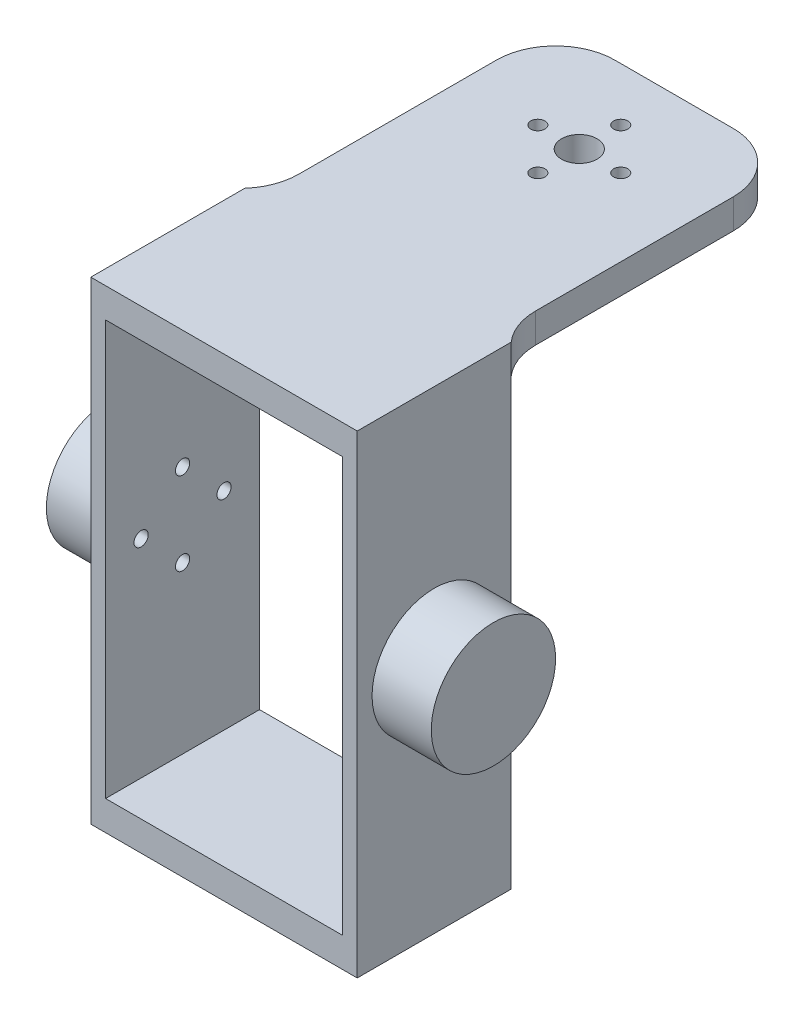
ISO-10303-21;
HEADER;
FILE_DESCRIPTION(('STEP AP214'),'2;1');
FILE_NAME('part.step','',(''),(''),'','','');
FILE_SCHEMA(('AUTOMOTIVE_DESIGN { 1 0 10303 214 1 1 1 1 }'));
ENDSEC;
DATA;
#1=APPLICATION_CONTEXT('core data for automotive mechanical design processes');
#2=APPLICATION_PROTOCOL_DEFINITION('international standard','automotive_design',2000,#1);
#3=PRODUCT_CONTEXT('',#1,'mechanical');
#4=PRODUCT('Part','Part','',(#3));
#5=PRODUCT_RELATED_PRODUCT_CATEGORY('part','',(#4));
#6=PRODUCT_DEFINITION_FORMATION('','',#4);
#7=PRODUCT_DEFINITION_CONTEXT('part definition',#1,'design');
#8=PRODUCT_DEFINITION('design','',#6,#7);
#9=PRODUCT_DEFINITION_SHAPE('','',#8);
#10=(LENGTH_UNIT() NAMED_UNIT(*) SI_UNIT(.MILLI.,.METRE.));
#11=(NAMED_UNIT(*) PLANE_ANGLE_UNIT() SI_UNIT($,.RADIAN.));
#12=(NAMED_UNIT(*) SI_UNIT($,.STERADIAN.) SOLID_ANGLE_UNIT());
#13=UNCERTAINTY_MEASURE_WITH_UNIT(LENGTH_MEASURE(1.E-05),#10,'distance_accuracy_value','');
#14=(GEOMETRIC_REPRESENTATION_CONTEXT(3) GLOBAL_UNCERTAINTY_ASSIGNED_CONTEXT((#13)) GLOBAL_UNIT_ASSIGNED_CONTEXT((#10,
#11,#12)) REPRESENTATION_CONTEXT('',''));
#15=CARTESIAN_POINT('',(0.,0.,0.));
#16=DIRECTION('',(0.,0.,1.));
#17=DIRECTION('',(1.,0.,0.));
#18=AXIS2_PLACEMENT_3D('',#15,#16,#17);
#19=CARTESIAN_POINT('',(0.,5.,-26.));
#20=DIRECTION('',(0.,0.,1.));
#21=DIRECTION('',(1.,0.,0.));
#22=AXIS2_PLACEMENT_3D('',#19,#20,#21);
#23=PLANE('',#22);
#24=DIRECTION('',(0.,-1.,0.));
#25=VECTOR('',#24,1.);
#26=CARTESIAN_POINT('',(0.,5.,-26.));
#27=LINE('',#26,#25);
#28=CARTESIAN_POINT('',(0.,75.,-26.));
#29=VERTEX_POINT('',#28);
#30=CARTESIAN_POINT('',(0.,0.,-26.));
#31=VERTEX_POINT('',#30);
#32=EDGE_CURVE('E206',#29,#31,#27,.T.);
#33=ORIENTED_EDGE('',*,*,#32,.F.);
#34=DIRECTION('',(1.,0.,0.));
#35=VECTOR('',#34,1.);
#36=CARTESIAN_POINT('',(0.,75.,-26.));
#37=LINE('',#36,#35);
#38=CARTESIAN_POINT('',(2.5,75.,-26.));
#39=VERTEX_POINT('',#38);
#40=EDGE_CURVE('E59',#29,#39,#37,.T.);
#41=ORIENTED_EDGE('',*,*,#40,.T.);
#42=DIRECTION('',(0.,-1.,0.));
#43=VECTOR('',#42,1.);
#44=CARTESIAN_POINT('',(2.5,75.,-26.));
#45=LINE('',#44,#43);
#46=CARTESIAN_POINT('',(2.5,5.,-26.));
#47=VERTEX_POINT('',#46);
#48=EDGE_CURVE('E193',#39,#47,#45,.T.);
#49=ORIENTED_EDGE('',*,*,#48,.T.);
#50=DIRECTION('',(-1.,0.,0.));
#51=VECTOR('',#50,1.);
#52=CARTESIAN_POINT('',(0.,5.,-26.));
#53=LINE('',#52,#51);
#54=CARTESIAN_POINT('',(42.5,5.,-26.));
#55=VERTEX_POINT('',#54);
#56=EDGE_CURVE('E203',#55,#47,#53,.T.);
#57=ORIENTED_EDGE('',*,*,#56,.F.);
#58=DIRECTION('',(0.,-1.,0.));
#59=VECTOR('',#58,1.);
#60=CARTESIAN_POINT('',(42.5,75.,-26.));
#61=LINE('',#60,#59);
#62=CARTESIAN_POINT('',(42.5,75.,-26.));
#63=VERTEX_POINT('',#62);
#64=EDGE_CURVE('E182',#63,#55,#61,.T.);
#65=ORIENTED_EDGE('',*,*,#64,.F.);
#66=DIRECTION('',(1.,0.,0.));
#67=VECTOR('',#66,1.);
#68=CARTESIAN_POINT('',(0.,75.,-26.));
#69=LINE('',#68,#67);
#70=CARTESIAN_POINT('',(45.,75.,-26.));
#71=VERTEX_POINT('',#70);
#72=EDGE_CURVE('E52',#63,#71,#69,.T.);
#73=ORIENTED_EDGE('',*,*,#72,.T.);
#74=DIRECTION('',(0.,-1.,0.));
#75=VECTOR('',#74,1.);
#76=CARTESIAN_POINT('',(45.,5.,-26.));
#77=LINE('',#76,#75);
#78=CARTESIAN_POINT('',(45.,0.,-26.));
#79=VERTEX_POINT('',#78);
#80=EDGE_CURVE('E217',#71,#79,#77,.T.);
#81=ORIENTED_EDGE('',*,*,#80,.T.);
#82=DIRECTION('',(-1.,0.,0.));
#83=VECTOR('',#82,1.);
#84=CARTESIAN_POINT('',(0.,0.,-26.));
#85=LINE('',#84,#83);
#86=EDGE_CURVE('E204',#79,#31,#85,.T.);
#87=ORIENTED_EDGE('',*,*,#86,.T.);
#88=EDGE_LOOP('',(#33,#41,#49,#57,#65,#73,#81,#87));
#89=FACE_BOUND('',#88,.T.);
#90=ADVANCED_FACE('F37',(#89),#23,.F.);
#91=CARTESIAN_POINT('',(0.,5.,0.));
#92=DIRECTION('',(0.,-1.,0.));
#93=DIRECTION('',(0.,0.,-1.));
#94=AXIS2_PLACEMENT_3D('',#91,#92,#93);
#95=PLANE('',#94);
#96=DIRECTION('',(0.,0.,1.));
#97=VECTOR('',#96,1.);
#98=CARTESIAN_POINT('',(42.5,5.,-26.));
#99=LINE('',#98,#97);
#100=CARTESIAN_POINT('',(42.5,5.,0.));
#101=VERTEX_POINT('',#100);
#102=EDGE_CURVE('E178',#55,#101,#99,.T.);
#103=ORIENTED_EDGE('',*,*,#102,.F.);
#104=ORIENTED_EDGE('',*,*,#56,.T.);
#105=DIRECTION('',(0.,0.,-1.));
#106=VECTOR('',#105,1.);
#107=CARTESIAN_POINT('',(2.5,5.,-26.));
#108=LINE('',#107,#106);
#109=CARTESIAN_POINT('',(2.5,5.,0.));
#110=VERTEX_POINT('',#109);
#111=EDGE_CURVE('E190',#110,#47,#108,.T.);
#112=ORIENTED_EDGE('',*,*,#111,.F.);
#113=DIRECTION('',(1.,0.,0.));
#114=VECTOR('',#113,1.);
#115=CARTESIAN_POINT('',(0.,5.,0.));
#116=LINE('',#115,#114);
#117=EDGE_CURVE('E201',#110,#101,#116,.T.);
#118=ORIENTED_EDGE('',*,*,#117,.T.);
#119=EDGE_LOOP('',(#103,#104,#112,#118));
#120=FACE_BOUND('',#119,.T.);
#121=ADVANCED_FACE('F333',(#120),#95,.F.);
#122=CARTESIAN_POINT('',(0.,5.,0.));
#123=DIRECTION('',(1.,0.,0.));
#124=DIRECTION('',(0.,0.,-1.));
#125=AXIS2_PLACEMENT_3D('',#122,#123,#124);
#126=PLANE('',#125);
#127=CARTESIAN_POINT('',(0.,40.,-13.));
#128=DIRECTION('',(-1.,0.,0.));
#129=DIRECTION('',(0.,0.,1.));
#130=AXIS2_PLACEMENT_3D('',#127,#128,#129);
#131=CIRCLE('',#130,10.5);
#132=CARTESIAN_POINT('',(0.,40.,-2.5));
#133=VERTEX_POINT('',#132);
#134=EDGE_CURVE('E154',#133,#133,#131,.T.);
#135=ORIENTED_EDGE('',*,*,#134,.F.);
#136=EDGE_LOOP('',(#135));
#137=FACE_BOUND('',#136,.T.);
#138=DIRECTION('',(0.,0.,1.));
#139=VECTOR('',#138,1.);
#140=CARTESIAN_POINT('',(0.,0.,0.));
#141=LINE('',#140,#139);
#142=CARTESIAN_POINT('',(0.,0.,0.));
#143=VERTEX_POINT('',#142);
#144=EDGE_CURVE('E152',#31,#143,#141,.T.);
#145=ORIENTED_EDGE('',*,*,#144,.T.);
#146=DIRECTION('',(0.,-1.,0.));
#147=VECTOR('',#146,1.);
#148=CARTESIAN_POINT('',(0.,5.,0.));
#149=LINE('',#148,#147);
#150=CARTESIAN_POINT('',(0.,80.,0.));
#151=VERTEX_POINT('',#150);
#152=EDGE_CURVE('E144',#151,#143,#149,.T.);
#153=ORIENTED_EDGE('',*,*,#152,.F.);
#154=DIRECTION('',(0.,0.,1.));
#155=VECTOR('',#154,1.);
#156=CARTESIAN_POINT('',(0.,80.,-26.));
#157=LINE('',#156,#155);
#158=CARTESIAN_POINT('',(0.,80.,-26.));
#159=VERTEX_POINT('',#158);
#160=EDGE_CURVE('E149',#159,#151,#157,.T.);
#161=ORIENTED_EDGE('',*,*,#160,.F.);
#162=EDGE_CURVE('E215',#159,#29,#27,.T.);
#163=ORIENTED_EDGE('',*,*,#162,.T.);
#164=ORIENTED_EDGE('',*,*,#32,.T.);
#165=EDGE_LOOP('',(#145,#153,#161,#163,#164));
#166=FACE_BOUND('',#165,.T.);
#167=ADVANCED_FACE('F146',(#137,#166),#126,.F.);
#168=CARTESIAN_POINT('',(0.,5.,0.));
#169=DIRECTION('',(0.,0.,-1.));
#170=DIRECTION('',(-1.,0.,0.));
#171=AXIS2_PLACEMENT_3D('',#168,#169,#170);
#172=PLANE('',#171);
#173=DIRECTION('',(0.,-1.,0.));
#174=VECTOR('',#173,1.);
#175=CARTESIAN_POINT('',(2.5,75.,0.));
#176=LINE('',#175,#174);
#177=CARTESIAN_POINT('',(2.5,75.,0.));
#178=VERTEX_POINT('',#177);
#179=EDGE_CURVE('E198',#178,#110,#176,.T.);
#180=ORIENTED_EDGE('',*,*,#179,.F.);
#181=DIRECTION('',(1.,0.,0.));
#182=VECTOR('',#181,1.);
#183=CARTESIAN_POINT('',(0.,75.,0.));
#184=LINE('',#183,#182);
#185=CARTESIAN_POINT('',(42.5,75.,0.));
#186=VERTEX_POINT('',#185);
#187=EDGE_CURVE('E170',#178,#186,#184,.T.);
#188=ORIENTED_EDGE('',*,*,#187,.T.);
#189=DIRECTION('',(0.,-1.,0.));
#190=VECTOR('',#189,1.);
#191=CARTESIAN_POINT('',(42.5,75.,0.));
#192=LINE('',#191,#190);
#193=EDGE_CURVE('E187',#186,#101,#192,.T.);
#194=ORIENTED_EDGE('',*,*,#193,.T.);
#195=ORIENTED_EDGE('',*,*,#117,.F.);
#196=EDGE_LOOP('',(#180,#188,#194,#195));
#197=FACE_BOUND('',#196,.T.);
#198=DIRECTION('',(1.,0.,0.));
#199=VECTOR('',#198,1.);
#200=CARTESIAN_POINT('',(0.,0.,0.));
#201=LINE('',#200,#199);
#202=CARTESIAN_POINT('',(45.,0.,0.));
#203=VERTEX_POINT('',#202);
#204=EDGE_CURVE('E208',#143,#203,#201,.T.);
#205=ORIENTED_EDGE('',*,*,#204,.T.);
#206=DIRECTION('',(0.,-1.,0.));
#207=VECTOR('',#206,1.);
#208=CARTESIAN_POINT('',(45.,5.,0.));
#209=LINE('',#208,#207);
#210=CARTESIAN_POINT('',(45.,80.,0.));
#211=VERTEX_POINT('',#210);
#212=EDGE_CURVE('E155',#211,#203,#209,.T.);
#213=ORIENTED_EDGE('',*,*,#212,.F.);
#214=DIRECTION('',(1.,0.,0.));
#215=VECTOR('',#214,1.);
#216=CARTESIAN_POINT('',(0.,80.,0.));
#217=LINE('',#216,#215);
#218=EDGE_CURVE('E158',#151,#211,#217,.T.);
#219=ORIENTED_EDGE('',*,*,#218,.F.);
#220=ORIENTED_EDGE('',*,*,#152,.T.);
#221=EDGE_LOOP('',(#205,#213,#219,#220));
#222=FACE_BOUND('',#221,.T.);
#223=ADVANCED_FACE('F159',(#197,#222),#172,.F.);
#224=CARTESIAN_POINT('',(45.,5.,0.));
#225=DIRECTION('',(-1.,0.,0.));
#226=DIRECTION('',(0.,0.,1.));
#227=AXIS2_PLACEMENT_3D('',#224,#225,#226);
#228=PLANE('',#227);
#229=CARTESIAN_POINT('',(45.,40.,-13.));
#230=DIRECTION('',(-1.,0.,0.));
#231=DIRECTION('',(0.,0.,1.));
#232=AXIS2_PLACEMENT_3D('',#229,#230,#231);
#233=CIRCLE('',#232,10.5);
#234=CARTESIAN_POINT('',(45.,40.,-2.5));
#235=VERTEX_POINT('',#234);
#236=EDGE_CURVE('E225',#235,#235,#233,.F.);
#237=ORIENTED_EDGE('',*,*,#236,.F.);
#238=EDGE_LOOP('',(#237));
#239=FACE_BOUND('',#238,.T.);
#240=DIRECTION('',(0.,0.,-1.));
#241=VECTOR('',#240,1.);
#242=CARTESIAN_POINT('',(45.,0.,0.));
#243=LINE('',#242,#241);
#244=EDGE_CURVE('E210',#203,#79,#243,.T.);
#245=ORIENTED_EDGE('',*,*,#244,.T.);
#246=ORIENTED_EDGE('',*,*,#80,.F.);
#247=CARTESIAN_POINT('',(45.,80.,-26.));
#248=VERTEX_POINT('',#247);
#249=EDGE_CURVE('E218',#248,#71,#77,.T.);
#250=ORIENTED_EDGE('',*,*,#249,.F.);
#251=DIRECTION('',(0.,0.,-1.));
#252=VECTOR('',#251,1.);
#253=CARTESIAN_POINT('',(45.,80.,-26.));
#254=LINE('',#253,#252);
#255=EDGE_CURVE('E164',#211,#248,#254,.T.);
#256=ORIENTED_EDGE('',*,*,#255,.F.);
#257=ORIENTED_EDGE('',*,*,#212,.T.);
#258=EDGE_LOOP('',(#245,#246,#250,#256,#257));
#259=FACE_BOUND('',#258,.T.);
#260=ADVANCED_FACE('F265',(#239,#259),#228,.F.);
#261=CARTESIAN_POINT('',(0.,0.,0.));
#262=DIRECTION('',(0.,-1.,0.));
#263=DIRECTION('',(0.,0.,-1.));
#264=AXIS2_PLACEMENT_3D('',#261,#262,#263);
#265=PLANE('',#264);
#266=ORIENTED_EDGE('',*,*,#144,.F.);
#267=ORIENTED_EDGE('',*,*,#86,.F.);
#268=ORIENTED_EDGE('',*,*,#244,.F.);
#269=ORIENTED_EDGE('',*,*,#204,.F.);
#270=EDGE_LOOP('',(#266,#267,#268,#269));
#271=FACE_BOUND('',#270,.T.);
#272=ADVANCED_FACE('F350',(#271),#265,.T.);
#273=CARTESIAN_POINT('',(2.5,75.,-26.));
#274=DIRECTION('',(-1.,0.,0.));
#275=DIRECTION('',(0.,0.,1.));
#276=AXIS2_PLACEMENT_3D('',#273,#274,#275);
#277=PLANE('',#276);
#278=CARTESIAN_POINT('',(2.5,40.,-20.));
#279=DIRECTION('',(-1.,0.,0.));
#280=DIRECTION('',(0.,0.,1.));
#281=AXIS2_PLACEMENT_3D('',#278,#279,#280);
#282=CIRCLE('',#281,1.2);
#283=CARTESIAN_POINT('',(2.5,40.,-18.8));
#284=VERTEX_POINT('',#283);
#285=EDGE_CURVE('E293',#284,#284,#282,.F.);
#286=ORIENTED_EDGE('',*,*,#285,.F.);
#287=EDGE_LOOP('',(#286));
#288=FACE_BOUND('',#287,.T.);
#289=CARTESIAN_POINT('',(2.5,33.,-13.));
#290=DIRECTION('',(-1.,0.,0.));
#291=DIRECTION('',(0.,0.,1.));
#292=AXIS2_PLACEMENT_3D('',#289,#290,#291);
#293=CIRCLE('',#292,1.2);
#294=CARTESIAN_POINT('',(2.5,33.,-11.8));
#295=VERTEX_POINT('',#294);
#296=EDGE_CURVE('E300',#295,#295,#293,.F.);
#297=ORIENTED_EDGE('',*,*,#296,.F.);
#298=EDGE_LOOP('',(#297));
#299=FACE_BOUND('',#298,.T.);
#300=CARTESIAN_POINT('',(2.5,40.0000000000001,-6.));
#301=DIRECTION('',(-1.,0.,0.));
#302=DIRECTION('',(0.,0.,1.));
#303=AXIS2_PLACEMENT_3D('',#300,#301,#302);
#304=CIRCLE('',#303,1.2);
#305=CARTESIAN_POINT('',(2.5,40.0000000000001,-4.8));
#306=VERTEX_POINT('',#305);
#307=EDGE_CURVE('E306',#306,#306,#304,.F.);
#308=ORIENTED_EDGE('',*,*,#307,.F.);
#309=EDGE_LOOP('',(#308));
#310=FACE_BOUND('',#309,.T.);
#311=CARTESIAN_POINT('',(2.5,47.,-13.));
#312=DIRECTION('',(-1.,0.,0.));
#313=DIRECTION('',(0.,0.,1.));
#314=AXIS2_PLACEMENT_3D('',#311,#312,#313);
#315=CIRCLE('',#314,1.2);
#316=CARTESIAN_POINT('',(2.5,47.,-11.8));
#317=VERTEX_POINT('',#316);
#318=EDGE_CURVE('E311',#317,#317,#315,.F.);
#319=ORIENTED_EDGE('',*,*,#318,.F.);
#320=EDGE_LOOP('',(#319));
#321=FACE_BOUND('',#320,.T.);
#322=ORIENTED_EDGE('',*,*,#111,.T.);
#323=ORIENTED_EDGE('',*,*,#48,.F.);
#324=DIRECTION('',(0.,0.,-1.));
#325=VECTOR('',#324,1.);
#326=CARTESIAN_POINT('',(2.5,75.,-26.));
#327=LINE('',#326,#325);
#328=EDGE_CURVE('E191',#178,#39,#327,.T.);
#329=ORIENTED_EDGE('',*,*,#328,.F.);
#330=ORIENTED_EDGE('',*,*,#179,.T.);
#331=EDGE_LOOP('',(#322,#323,#329,#330));
#332=FACE_BOUND('',#331,.T.);
#333=ADVANCED_FACE('F356',(#288,#299,#310,#321,#332),#277,.F.);
#334=CARTESIAN_POINT('',(42.5,75.,-26.));
#335=DIRECTION('',(1.,0.,0.));
#336=DIRECTION('',(0.,0.,-1.));
#337=AXIS2_PLACEMENT_3D('',#334,#335,#336);
#338=PLANE('',#337);
#339=CARTESIAN_POINT('',(42.5,40.,-13.));
#340=DIRECTION('',(1.,0.,0.));
#341=DIRECTION('',(0.,0.,-1.));
#342=AXIS2_PLACEMENT_3D('',#339,#340,#341);
#343=CIRCLE('',#342,10.5);
#344=CARTESIAN_POINT('',(42.5,40.,-23.5));
#345=VERTEX_POINT('',#344);
#346=EDGE_CURVE('E222',#345,#345,#343,.F.);
#347=ORIENTED_EDGE('',*,*,#346,.F.);
#348=EDGE_LOOP('',(#347));
#349=FACE_BOUND('',#348,.T.);
#350=ORIENTED_EDGE('',*,*,#102,.T.);
#351=ORIENTED_EDGE('',*,*,#193,.F.);
#352=DIRECTION('',(0.,0.,1.));
#353=VECTOR('',#352,1.);
#354=CARTESIAN_POINT('',(42.5,75.,-26.));
#355=LINE('',#354,#353);
#356=EDGE_CURVE('E180',#63,#186,#355,.T.);
#357=ORIENTED_EDGE('',*,*,#356,.F.);
#358=ORIENTED_EDGE('',*,*,#64,.T.);
#359=EDGE_LOOP('',(#350,#351,#357,#358));
#360=FACE_BOUND('',#359,.T.);
#361=ADVANCED_FACE('F414',(#349,#360),#338,.F.);
#362=CARTESIAN_POINT('',(0.,75.,0.));
#363=DIRECTION('',(0.,1.,0.));
#364=DIRECTION('',(0.,0.,1.));
#365=AXIS2_PLACEMENT_3D('',#362,#363,#364);
#366=PLANE('',#365);
#367=CARTESIAN_POINT('',(22.5000000000001,75.,-53.));
#368=DIRECTION('',(0.,1.,0.));
#369=DIRECTION('',(0.,0.,1.));
#370=AXIS2_PLACEMENT_3D('',#367,#368,#369);
#371=CIRCLE('',#370,1.2);
#372=CARTESIAN_POINT('',(22.5000000000001,75.,-51.8));
#373=VERTEX_POINT('',#372);
#374=EDGE_CURVE('E460',#373,#373,#371,.T.);
#375=ORIENTED_EDGE('',*,*,#374,.T.);
#376=EDGE_LOOP('',(#375));
#377=FACE_BOUND('',#376,.T.);
#378=CARTESIAN_POINT('',(22.5,75.,-67.));
#379=DIRECTION('',(0.,1.,0.));
#380=DIRECTION('',(0.,0.,1.));
#381=AXIS2_PLACEMENT_3D('',#378,#379,#380);
#382=CIRCLE('',#381,1.2);
#383=CARTESIAN_POINT('',(22.5,75.,-65.8));
#384=VERTEX_POINT('',#383);
#385=EDGE_CURVE('E465',#384,#384,#382,.T.);
#386=ORIENTED_EDGE('',*,*,#385,.T.);
#387=EDGE_LOOP('',(#386));
#388=FACE_BOUND('',#387,.T.);
#389=CARTESIAN_POINT('',(15.5,75.,-60.));
#390=DIRECTION('',(0.,1.,0.));
#391=DIRECTION('',(0.,0.,1.));
#392=AXIS2_PLACEMENT_3D('',#389,#390,#391);
#393=CIRCLE('',#392,1.2);
#394=CARTESIAN_POINT('',(15.5,75.,-58.8));
#395=VERTEX_POINT('',#394);
#396=EDGE_CURVE('E468',#395,#395,#393,.T.);
#397=ORIENTED_EDGE('',*,*,#396,.T.);
#398=EDGE_LOOP('',(#397));
#399=FACE_BOUND('',#398,.T.);
#400=CARTESIAN_POINT('',(22.5,75.,-60.));
#401=DIRECTION('',(0.,1.,0.));
#402=DIRECTION('',(0.,0.,1.));
#403=AXIS2_PLACEMENT_3D('',#400,#401,#402);
#404=CIRCLE('',#403,3.);
#405=CARTESIAN_POINT('',(22.5,75.,-57.));
#406=VERTEX_POINT('',#405);
#407=EDGE_CURVE('E450',#406,#406,#404,.T.);
#408=ORIENTED_EDGE('',*,*,#407,.T.);
#409=EDGE_LOOP('',(#408));
#410=FACE_BOUND('',#409,.T.);
#411=CARTESIAN_POINT('',(29.5,75.,-60.));
#412=DIRECTION('',(0.,1.,0.));
#413=DIRECTION('',(0.,0.,1.));
#414=AXIS2_PLACEMENT_3D('',#411,#412,#413);
#415=CIRCLE('',#414,1.2);
#416=CARTESIAN_POINT('',(29.5,75.,-58.8));
#417=VERTEX_POINT('',#416);
#418=EDGE_CURVE('E453',#417,#417,#415,.T.);
#419=ORIENTED_EDGE('',*,*,#418,.T.);
#420=EDGE_LOOP('',(#419));
#421=FACE_BOUND('',#420,.T.);
#422=DIRECTION('',(0.,0.,1.));
#423=VECTOR('',#422,1.);
#424=CARTESIAN_POINT('',(2.5,75.,-76.));
#425=LINE('',#424,#423);
#426=CARTESIAN_POINT('',(2.5,75.,-66.));
#427=VERTEX_POINT('',#426);
#428=CARTESIAN_POINT('',(2.5,75.,-32.6143782776615));
#429=VERTEX_POINT('',#428);
#430=EDGE_CURVE('E280',#427,#429,#425,.T.);
#431=ORIENTED_EDGE('',*,*,#430,.F.);
#432=CARTESIAN_POINT('',(12.5,75.,-66.));
#433=DIRECTION('',(0.,1.,0.));
#434=DIRECTION('',(0.,0.,1.));
#435=AXIS2_PLACEMENT_3D('',#432,#433,#434);
#436=CIRCLE('',#435,10.);
#437=CARTESIAN_POINT('',(12.5,75.,-76.));
#438=VERTEX_POINT('',#437);
#439=EDGE_CURVE('E243',#427,#438,#436,.F.);
#440=ORIENTED_EDGE('',*,*,#439,.T.);
#441=DIRECTION('',(-1.,0.,0.));
#442=VECTOR('',#441,1.);
#443=CARTESIAN_POINT('',(2.5,75.,-76.));
#444=LINE('',#443,#442);
#445=CARTESIAN_POINT('',(32.5,75.,-76.));
#446=VERTEX_POINT('',#445);
#447=EDGE_CURVE('E443',#446,#438,#444,.T.);
#448=ORIENTED_EDGE('',*,*,#447,.F.);
#449=CARTESIAN_POINT('',(32.5,75.,-66.));
#450=DIRECTION('',(0.,1.,0.));
#451=DIRECTION('',(0.,0.,1.));
#452=AXIS2_PLACEMENT_3D('',#449,#450,#451);
#453=CIRCLE('',#452,10.);
#454=CARTESIAN_POINT('',(42.5,75.,-66.));
#455=VERTEX_POINT('',#454);
#456=EDGE_CURVE('E241',#446,#455,#453,.F.);
#457=ORIENTED_EDGE('',*,*,#456,.T.);
#458=DIRECTION('',(0.,0.,1.));
#459=VECTOR('',#458,1.);
#460=CARTESIAN_POINT('',(42.5,75.,-76.));
#461=LINE('',#460,#459);
#462=CARTESIAN_POINT('',(42.5,75.,-32.6143782776615));
#463=VERTEX_POINT('',#462);
#464=EDGE_CURVE('E258',#455,#463,#461,.T.);
#465=ORIENTED_EDGE('',*,*,#464,.T.);
#466=CARTESIAN_POINT('',(52.5,75.,-32.6143782776615));
#467=DIRECTION('',(0.,1.,0.));
#468=DIRECTION('',(0.,0.,1.));
#469=AXIS2_PLACEMENT_3D('',#466,#467,#468);
#470=CIRCLE('',#469,10.);
#471=EDGE_CURVE('E45',#463,#71,#470,.T.);
#472=ORIENTED_EDGE('',*,*,#471,.T.);
#473=ORIENTED_EDGE('',*,*,#72,.F.);
#474=ORIENTED_EDGE('',*,*,#356,.T.);
#475=ORIENTED_EDGE('',*,*,#187,.F.);
#476=ORIENTED_EDGE('',*,*,#328,.T.);
#477=ORIENTED_EDGE('',*,*,#40,.F.);
#478=CARTESIAN_POINT('',(-7.5,75.,-32.6143782776615));
#479=DIRECTION('',(0.,1.,0.));
#480=DIRECTION('',(0.,0.,1.));
#481=AXIS2_PLACEMENT_3D('',#478,#479,#480);
#482=CIRCLE('',#481,10.);
#483=EDGE_CURVE('E253',#29,#429,#482,.T.);
#484=ORIENTED_EDGE('',*,*,#483,.T.);
#485=EDGE_LOOP('',(#431,#440,#448,#457,#465,#472,#473,#474,#475,#476,#477,#484));
#486=FACE_BOUND('',#485,.T.);
#487=ADVANCED_FACE('F256',(#377,#388,#399,#410,#421,#486),#366,.F.);
#488=CARTESIAN_POINT('',(0.,80.,0.));
#489=DIRECTION('',(0.,1.,0.));
#490=DIRECTION('',(0.,0.,1.));
#491=AXIS2_PLACEMENT_3D('',#488,#489,#490);
#492=PLANE('',#491);
#493=CARTESIAN_POINT('',(22.5000000000001,80.,-53.));
#494=DIRECTION('',(0.,1.,0.));
#495=DIRECTION('',(-1.,0.,0.));
#496=AXIS2_PLACEMENT_3D('',#493,#494,#495);
#497=CIRCLE('',#496,1.2);
#498=CARTESIAN_POINT('',(21.3000000000001,80.,-53.));
#499=VERTEX_POINT('',#498);
#500=EDGE_CURVE('E472',#499,#499,#497,.T.);
#501=ORIENTED_EDGE('',*,*,#500,.F.);
#502=EDGE_LOOP('',(#501));
#503=FACE_BOUND('',#502,.T.);
#504=CARTESIAN_POINT('',(22.5,80.,-67.));
#505=DIRECTION('',(0.,1.,0.));
#506=DIRECTION('',(1.,0.,0.));
#507=AXIS2_PLACEMENT_3D('',#504,#505,#506);
#508=CIRCLE('',#507,1.2);
#509=CARTESIAN_POINT('',(23.7,80.,-67.));
#510=VERTEX_POINT('',#509);
#511=EDGE_CURVE('E471',#510,#510,#508,.T.);
#512=ORIENTED_EDGE('',*,*,#511,.F.);
#513=EDGE_LOOP('',(#512));
#514=FACE_BOUND('',#513,.T.);
#515=CARTESIAN_POINT('',(15.5,80.,-60.));
#516=DIRECTION('',(0.,1.,0.));
#517=DIRECTION('',(0.,0.,-1.));
#518=AXIS2_PLACEMENT_3D('',#515,#516,#517);
#519=CIRCLE('',#518,1.2);
#520=CARTESIAN_POINT('',(15.5,80.,-61.2));
#521=VERTEX_POINT('',#520);
#522=EDGE_CURVE('E475',#521,#521,#519,.T.);
#523=ORIENTED_EDGE('',*,*,#522,.F.);
#524=EDGE_LOOP('',(#523));
#525=FACE_BOUND('',#524,.T.);
#526=CARTESIAN_POINT('',(22.5,80.,-60.));
#527=DIRECTION('',(0.,1.,0.));
#528=DIRECTION('',(0.,0.,1.));
#529=AXIS2_PLACEMENT_3D('',#526,#527,#528);
#530=CIRCLE('',#529,3.);
#531=CARTESIAN_POINT('',(22.5,80.,-57.));
#532=VERTEX_POINT('',#531);
#533=EDGE_CURVE('E456',#532,#532,#530,.T.);
#534=ORIENTED_EDGE('',*,*,#533,.F.);
#535=EDGE_LOOP('',(#534));
#536=FACE_BOUND('',#535,.T.);
#537=CARTESIAN_POINT('',(29.5,80.,-60.));
#538=DIRECTION('',(0.,1.,0.));
#539=DIRECTION('',(0.,0.,1.));
#540=AXIS2_PLACEMENT_3D('',#537,#538,#539);
#541=CIRCLE('',#540,1.2);
#542=CARTESIAN_POINT('',(29.5,80.,-58.8));
#543=VERTEX_POINT('',#542);
#544=EDGE_CURVE('E457',#543,#543,#541,.T.);
#545=ORIENTED_EDGE('',*,*,#544,.F.);
#546=EDGE_LOOP('',(#545));
#547=FACE_BOUND('',#546,.T.);
#548=DIRECTION('',(1.,0.,0.));
#549=VECTOR('',#548,1.);
#550=CARTESIAN_POINT('',(2.5,80.,-76.));
#551=LINE('',#550,#549);
#552=CARTESIAN_POINT('',(12.5,80.,-76.));
#553=VERTEX_POINT('',#552);
#554=CARTESIAN_POINT('',(32.5,80.,-76.));
#555=VERTEX_POINT('',#554);
#556=EDGE_CURVE('E445',#553,#555,#551,.T.);
#557=ORIENTED_EDGE('',*,*,#556,.F.);
#558=CARTESIAN_POINT('',(12.5,80.,-66.));
#559=DIRECTION('',(0.,1.,0.));
#560=DIRECTION('',(0.,0.,1.));
#561=AXIS2_PLACEMENT_3D('',#558,#559,#560);
#562=CIRCLE('',#561,10.);
#563=CARTESIAN_POINT('',(2.5,80.,-66.));
#564=VERTEX_POINT('',#563);
#565=EDGE_CURVE('E234',#553,#564,#562,.T.);
#566=ORIENTED_EDGE('',*,*,#565,.T.);
#567=DIRECTION('',(0.,0.,1.));
#568=VECTOR('',#567,1.);
#569=CARTESIAN_POINT('',(2.5,80.,-76.));
#570=LINE('',#569,#568);
#571=CARTESIAN_POINT('',(2.5,80.,-32.6143782776615));
#572=VERTEX_POINT('',#571);
#573=EDGE_CURVE('E276',#564,#572,#570,.T.);
#574=ORIENTED_EDGE('',*,*,#573,.T.);
#575=CARTESIAN_POINT('',(-7.5,80.,-32.6143782776615));
#576=DIRECTION('',(0.,1.,0.));
#577=DIRECTION('',(0.,0.,1.));
#578=AXIS2_PLACEMENT_3D('',#575,#576,#577);
#579=CIRCLE('',#578,10.);
#580=EDGE_CURVE('E169',#572,#159,#579,.F.);
#581=ORIENTED_EDGE('',*,*,#580,.T.);
#582=ORIENTED_EDGE('',*,*,#160,.T.);
#583=ORIENTED_EDGE('',*,*,#218,.T.);
#584=ORIENTED_EDGE('',*,*,#255,.T.);
#585=CARTESIAN_POINT('',(52.5,80.,-32.6143782776615));
#586=DIRECTION('',(0.,1.,0.));
#587=DIRECTION('',(0.,0.,1.));
#588=AXIS2_PLACEMENT_3D('',#585,#586,#587);
#589=CIRCLE('',#588,10.);
#590=CARTESIAN_POINT('',(42.5,80.,-32.6143782776615));
#591=VERTEX_POINT('',#590);
#592=EDGE_CURVE('E11',#248,#591,#589,.F.);
#593=ORIENTED_EDGE('',*,*,#592,.T.);
#594=DIRECTION('',(0.,0.,1.));
#595=VECTOR('',#594,1.);
#596=CARTESIAN_POINT('',(42.5,80.,-76.));
#597=LINE('',#596,#595);
#598=CARTESIAN_POINT('',(42.5,80.,-66.));
#599=VERTEX_POINT('',#598);
#600=EDGE_CURVE('E271',#599,#591,#597,.T.);
#601=ORIENTED_EDGE('',*,*,#600,.F.);
#602=CARTESIAN_POINT('',(32.5,80.,-66.));
#603=DIRECTION('',(0.,1.,0.));
#604=DIRECTION('',(0.,0.,1.));
#605=AXIS2_PLACEMENT_3D('',#602,#603,#604);
#606=CIRCLE('',#605,10.);
#607=EDGE_CURVE('E232',#599,#555,#606,.T.);
#608=ORIENTED_EDGE('',*,*,#607,.T.);
#609=EDGE_LOOP('',(#557,#566,#574,#581,#582,#583,#584,#593,#601,#608));
#610=FACE_BOUND('',#609,.T.);
#611=ADVANCED_FACE('F167',(#503,#514,#525,#536,#547,#610),#492,.T.);
#612=CARTESIAN_POINT('',(-10.,40.,-13.));
#613=DIRECTION('',(1.,0.,0.));
#614=DIRECTION('',(0.,0.,-1.));
#615=AXIS2_PLACEMENT_3D('',#612,#613,#614);
#616=CYLINDRICAL_SURFACE('',#615,10.5);
#617=CARTESIAN_POINT('',(-10.,40.,-13.));
#618=DIRECTION('',(-1.,0.,0.));
#619=DIRECTION('',(0.,0.,1.));
#620=AXIS2_PLACEMENT_3D('',#617,#618,#619);
#621=CIRCLE('',#620,10.5);
#622=CARTESIAN_POINT('',(-10.,40.,-2.5));
#623=VERTEX_POINT('',#622);
#624=EDGE_CURVE('E173',#623,#623,#621,.T.);
#625=ORIENTED_EDGE('',*,*,#624,.F.);
#626=EDGE_LOOP('',(#625));
#627=FACE_BOUND('',#626,.T.);
#628=ORIENTED_EDGE('',*,*,#134,.T.);
#629=EDGE_LOOP('',(#628));
#630=FACE_BOUND('',#629,.T.);
#631=ADVANCED_FACE('F325',(#627,#630),#616,.T.);
#632=CARTESIAN_POINT('',(-10.,40.,-13.));
#633=DIRECTION('',(-1.,0.,0.));
#634=DIRECTION('',(0.,0.,1.));
#635=AXIS2_PLACEMENT_3D('',#632,#633,#634);
#636=PLANE('',#635);
#637=CARTESIAN_POINT('',(-10.,40.,-13.));
#638=DIRECTION('',(-1.,0.,0.));
#639=DIRECTION('',(0.,0.,1.));
#640=AXIS2_PLACEMENT_3D('',#637,#638,#639);
#641=CIRCLE('',#640,3.);
#642=CARTESIAN_POINT('',(-10.,40.,-10.));
#643=VERTEX_POINT('',#642);
#644=EDGE_CURVE('E286',#643,#643,#641,.T.);
#645=ORIENTED_EDGE('',*,*,#644,.F.);
#646=EDGE_LOOP('',(#645));
#647=FACE_BOUND('',#646,.T.);
#648=CARTESIAN_POINT('',(-10.,40.,-20.));
#649=DIRECTION('',(-1.,0.,0.));
#650=DIRECTION('',(0.,1.,0.));
#651=AXIS2_PLACEMENT_3D('',#648,#649,#650);
#652=CIRCLE('',#651,1.2);
#653=CARTESIAN_POINT('',(-10.,41.2,-20.));
#654=VERTEX_POINT('',#653);
#655=EDGE_CURVE('E297',#654,#654,#652,.T.);
#656=ORIENTED_EDGE('',*,*,#655,.F.);
#657=EDGE_LOOP('',(#656));
#658=FACE_BOUND('',#657,.T.);
#659=CARTESIAN_POINT('',(-10.,33.,-13.));
#660=DIRECTION('',(-1.,0.,0.));
#661=DIRECTION('',(0.,0.,-1.));
#662=AXIS2_PLACEMENT_3D('',#659,#660,#661);
#663=CIRCLE('',#662,1.2);
#664=CARTESIAN_POINT('',(-10.,33.,-14.2));
#665=VERTEX_POINT('',#664);
#666=EDGE_CURVE('E303',#665,#665,#663,.T.);
#667=ORIENTED_EDGE('',*,*,#666,.F.);
#668=EDGE_LOOP('',(#667));
#669=FACE_BOUND('',#668,.T.);
#670=CARTESIAN_POINT('',(-10.,40.0000000000001,-6.));
#671=DIRECTION('',(-1.,0.,0.));
#672=DIRECTION('',(0.,-1.,0.));
#673=AXIS2_PLACEMENT_3D('',#670,#671,#672);
#674=CIRCLE('',#673,1.2);
#675=CARTESIAN_POINT('',(-10.,38.8000000000001,-5.99999999999999));
#676=VERTEX_POINT('',#675);
#677=EDGE_CURVE('E290',#676,#676,#674,.T.);
#678=ORIENTED_EDGE('',*,*,#677,.F.);
#679=EDGE_LOOP('',(#678));
#680=FACE_BOUND('',#679,.T.);
#681=CARTESIAN_POINT('',(-10.,47.,-13.));
#682=DIRECTION('',(-1.,0.,0.));
#683=DIRECTION('',(0.,0.,1.));
#684=AXIS2_PLACEMENT_3D('',#681,#682,#683);
#685=CIRCLE('',#684,1.2);
#686=CARTESIAN_POINT('',(-10.,47.,-11.8));
#687=VERTEX_POINT('',#686);
#688=EDGE_CURVE('E296',#687,#687,#685,.T.);
#689=ORIENTED_EDGE('',*,*,#688,.F.);
#690=EDGE_LOOP('',(#689));
#691=FACE_BOUND('',#690,.T.);
#692=ORIENTED_EDGE('',*,*,#624,.T.);
#693=EDGE_LOOP('',(#692));
#694=FACE_BOUND('',#693,.T.);
#695=ADVANCED_FACE('F323',(#647,#658,#669,#680,#691,#694),#636,.T.);
#696=CARTESIAN_POINT('',(40.,40.,-13.));
#697=DIRECTION('',(-1.,0.,0.));
#698=DIRECTION('',(0.,0.,1.));
#699=AXIS2_PLACEMENT_3D('',#696,#697,#698);
#700=PLANE('',#699);
#701=CARTESIAN_POINT('',(40.,40.,-13.));
#702=DIRECTION('',(-1.,0.,0.));
#703=DIRECTION('',(0.,0.,1.));
#704=AXIS2_PLACEMENT_3D('',#701,#702,#703);
#705=CIRCLE('',#704,10.5);
#706=CARTESIAN_POINT('',(40.,40.,-2.5));
#707=VERTEX_POINT('',#706);
#708=EDGE_CURVE('E314',#707,#707,#705,.T.);
#709=ORIENTED_EDGE('',*,*,#708,.T.);
#710=EDGE_LOOP('',(#709));
#711=FACE_BOUND('',#710,.T.);
#712=ADVANCED_FACE('F402',(#711),#700,.T.);
#713=CARTESIAN_POINT('',(40.,40.,-13.));
#714=DIRECTION('',(1.,0.,0.));
#715=DIRECTION('',(0.,0.,-1.));
#716=AXIS2_PLACEMENT_3D('',#713,#714,#715);
#717=CYLINDRICAL_SURFACE('',#716,10.5);
#718=ORIENTED_EDGE('',*,*,#708,.F.);
#719=EDGE_LOOP('',(#718));
#720=FACE_BOUND('',#719,.T.);
#721=ORIENTED_EDGE('',*,*,#346,.T.);
#722=EDGE_LOOP('',(#721));
#723=FACE_BOUND('',#722,.T.);
#724=ADVANCED_FACE('F364',(#720,#723),#717,.T.);
#725=ORIENTED_EDGE('',*,*,#236,.T.);
#726=EDGE_LOOP('',(#725));
#727=FACE_BOUND('',#726,.T.);
#728=CARTESIAN_POINT('',(55.,40.,-13.));
#729=DIRECTION('',(1.,0.,0.));
#730=DIRECTION('',(0.,0.,-1.));
#731=AXIS2_PLACEMENT_3D('',#728,#729,#730);
#732=CIRCLE('',#731,10.5);
#733=CARTESIAN_POINT('',(55.,40.,-23.5));
#734=VERTEX_POINT('',#733);
#735=EDGE_CURVE('E278',#734,#734,#732,.T.);
#736=ORIENTED_EDGE('',*,*,#735,.F.);
#737=EDGE_LOOP('',(#736));
#738=FACE_BOUND('',#737,.T.);
#739=ADVANCED_FACE('F360',(#727,#738),#717,.T.);
#740=CARTESIAN_POINT('',(50.001,47.,-13.));
#741=DIRECTION('',(-1.,0.,0.));
#742=DIRECTION('',(0.,0.,1.));
#743=AXIS2_PLACEMENT_3D('',#740,#741,#742);
#744=CYLINDRICAL_SURFACE('',#743,1.2);
#745=ORIENTED_EDGE('',*,*,#688,.T.);
#746=EDGE_LOOP('',(#745));
#747=FACE_BOUND('',#746,.T.);
#748=ORIENTED_EDGE('',*,*,#318,.T.);
#749=EDGE_LOOP('',(#748));
#750=FACE_BOUND('',#749,.T.);
#751=ADVANCED_FACE('F363',(#747,#750),#744,.F.);
#752=CARTESIAN_POINT('',(50.001,40.0000000000001,-6.));
#753=DIRECTION('',(-1.,0.,0.));
#754=DIRECTION('',(0.,0.,1.));
#755=AXIS2_PLACEMENT_3D('',#752,#753,#754);
#756=CYLINDRICAL_SURFACE('',#755,1.2);
#757=ORIENTED_EDGE('',*,*,#677,.T.);
#758=EDGE_LOOP('',(#757));
#759=FACE_BOUND('',#758,.T.);
#760=ORIENTED_EDGE('',*,*,#307,.T.);
#761=EDGE_LOOP('',(#760));
#762=FACE_BOUND('',#761,.T.);
#763=ADVANCED_FACE('F394',(#759,#762),#756,.F.);
#764=CARTESIAN_POINT('',(50.001,33.,-13.));
#765=DIRECTION('',(-1.,0.,0.));
#766=DIRECTION('',(0.,0.,1.));
#767=AXIS2_PLACEMENT_3D('',#764,#765,#766);
#768=CYLINDRICAL_SURFACE('',#767,1.2);
#769=ORIENTED_EDGE('',*,*,#666,.T.);
#770=EDGE_LOOP('',(#769));
#771=FACE_BOUND('',#770,.T.);
#772=ORIENTED_EDGE('',*,*,#296,.T.);
#773=EDGE_LOOP('',(#772));
#774=FACE_BOUND('',#773,.T.);
#775=ADVANCED_FACE('F390',(#771,#774),#768,.F.);
#776=CARTESIAN_POINT('',(50.001,40.,-20.));
#777=DIRECTION('',(-1.,0.,0.));
#778=DIRECTION('',(0.,0.,1.));
#779=AXIS2_PLACEMENT_3D('',#776,#777,#778);
#780=CYLINDRICAL_SURFACE('',#779,1.2);
#781=ORIENTED_EDGE('',*,*,#655,.T.);
#782=EDGE_LOOP('',(#781));
#783=FACE_BOUND('',#782,.T.);
#784=ORIENTED_EDGE('',*,*,#285,.T.);
#785=EDGE_LOOP('',(#784));
#786=FACE_BOUND('',#785,.T.);
#787=ADVANCED_FACE('F386',(#783,#786),#780,.F.);
#788=CARTESIAN_POINT('',(-8.,40.,-13.));
#789=DIRECTION('',(-1.,0.,0.));
#790=DIRECTION('',(0.,0.,1.));
#791=AXIS2_PLACEMENT_3D('',#788,#789,#790);
#792=CYLINDRICAL_SURFACE('',#791,3.);
#793=CARTESIAN_POINT('',(-8.,40.,-13.));
#794=DIRECTION('',(-1.,0.,0.));
#795=DIRECTION('',(0.,0.,1.));
#796=AXIS2_PLACEMENT_3D('',#793,#794,#795);
#797=CIRCLE('',#796,3.);
#798=CARTESIAN_POINT('',(-8.,40.,-10.));
#799=VERTEX_POINT('',#798);
#800=EDGE_CURVE('E287',#799,#799,#797,.T.);
#801=ORIENTED_EDGE('',*,*,#800,.F.);
#802=EDGE_LOOP('',(#801));
#803=FACE_BOUND('',#802,.T.);
#804=ORIENTED_EDGE('',*,*,#644,.T.);
#805=EDGE_LOOP('',(#804));
#806=FACE_BOUND('',#805,.T.);
#807=ADVANCED_FACE('F379',(#803,#806),#792,.F.);
#808=CARTESIAN_POINT('',(-8.,40.,-13.));
#809=DIRECTION('',(-1.,0.,0.));
#810=DIRECTION('',(0.,0.,1.));
#811=AXIS2_PLACEMENT_3D('',#808,#809,#810);
#812=PLANE('',#811);
#813=ORIENTED_EDGE('',*,*,#800,.T.);
#814=EDGE_LOOP('',(#813));
#815=FACE_BOUND('',#814,.T.);
#816=ADVANCED_FACE('F371',(#815),#812,.T.);
#817=CARTESIAN_POINT('',(55.,40.,-13.));
#818=DIRECTION('',(1.,0.,0.));
#819=DIRECTION('',(0.,0.,-1.));
#820=AXIS2_PLACEMENT_3D('',#817,#818,#819);
#821=PLANE('',#820);
#822=ORIENTED_EDGE('',*,*,#735,.T.);
#823=EDGE_LOOP('',(#822));
#824=FACE_BOUND('',#823,.T.);
#825=ADVANCED_FACE('F368',(#824),#821,.T.);
#826=CARTESIAN_POINT('',(2.5,75.,-76.));
#827=DIRECTION('',(1.,0.,0.));
#828=DIRECTION('',(0.,0.,-1.));
#829=AXIS2_PLACEMENT_3D('',#826,#827,#828);
#830=PLANE('',#829);
#831=ORIENTED_EDGE('',*,*,#573,.F.);
#832=DIRECTION('',(0.,1.,0.));
#833=VECTOR('',#832,1.);
#834=CARTESIAN_POINT('',(2.5,75.,-66.));
#835=LINE('',#834,#833);
#836=EDGE_CURVE('E239',#564,#427,#835,.F.);
#837=ORIENTED_EDGE('',*,*,#836,.T.);
#838=ORIENTED_EDGE('',*,*,#430,.T.);
#839=DIRECTION('',(0.,1.,0.));
#840=VECTOR('',#839,1.);
#841=CARTESIAN_POINT('',(2.5,75.,-32.6143782776615));
#842=LINE('',#841,#840);
#843=EDGE_CURVE('E236',#429,#572,#842,.T.);
#844=ORIENTED_EDGE('',*,*,#843,.T.);
#845=EDGE_LOOP('',(#831,#837,#838,#844));
#846=FACE_BOUND('',#845,.T.);
#847=ADVANCED_FACE('F370',(#846),#830,.F.);
#848=CARTESIAN_POINT('',(42.5,75.,-76.));
#849=DIRECTION('',(-1.,0.,0.));
#850=DIRECTION('',(0.,0.,1.));
#851=AXIS2_PLACEMENT_3D('',#848,#849,#850);
#852=PLANE('',#851);
#853=ORIENTED_EDGE('',*,*,#464,.F.);
#854=DIRECTION('',(0.,-1.,0.));
#855=VECTOR('',#854,1.);
#856=CARTESIAN_POINT('',(42.5,80.,-66.));
#857=LINE('',#856,#855);
#858=EDGE_CURVE('E248',#455,#599,#857,.F.);
#859=ORIENTED_EDGE('',*,*,#858,.T.);
#860=ORIENTED_EDGE('',*,*,#600,.T.);
#861=DIRECTION('',(0.,-1.,0.));
#862=VECTOR('',#861,1.);
#863=CARTESIAN_POINT('',(42.5,75.,-32.6143782776615));
#864=LINE('',#863,#862);
#865=EDGE_CURVE('E245',#591,#463,#864,.T.);
#866=ORIENTED_EDGE('',*,*,#865,.T.);
#867=EDGE_LOOP('',(#853,#859,#860,#866));
#868=FACE_BOUND('',#867,.T.);
#869=ADVANCED_FACE('F274',(#868),#852,.F.);
#870=CARTESIAN_POINT('',(0.,0.,-76.));
#871=DIRECTION('',(0.,0.,-1.));
#872=DIRECTION('',(-1.,0.,0.));
#873=AXIS2_PLACEMENT_3D('',#870,#871,#872);
#874=PLANE('',#873);
#875=ORIENTED_EDGE('',*,*,#447,.T.);
#876=DIRECTION('',(0.,1.,0.));
#877=VECTOR('',#876,1.);
#878=CARTESIAN_POINT('',(12.5,80.,-76.));
#879=LINE('',#878,#877);
#880=EDGE_CURVE('E229',#438,#553,#879,.T.);
#881=ORIENTED_EDGE('',*,*,#880,.T.);
#882=ORIENTED_EDGE('',*,*,#556,.T.);
#883=DIRECTION('',(0.,-1.,0.));
#884=VECTOR('',#883,1.);
#885=CARTESIAN_POINT('',(32.5,75.,-76.));
#886=LINE('',#885,#884);
#887=EDGE_CURVE('E226',#555,#446,#886,.T.);
#888=ORIENTED_EDGE('',*,*,#887,.T.);
#889=EDGE_LOOP('',(#875,#881,#882,#888));
#890=FACE_BOUND('',#889,.T.);
#891=ADVANCED_FACE('F504',(#890),#874,.T.);
#892=CARTESIAN_POINT('',(12.5,0.,-66.));
#893=DIRECTION('',(0.,-1.,0.));
#894=DIRECTION('',(0.,0.,-1.));
#895=AXIS2_PLACEMENT_3D('',#892,#893,#894);
#896=CYLINDRICAL_SURFACE('',#895,10.);
#897=ORIENTED_EDGE('',*,*,#439,.F.);
#898=ORIENTED_EDGE('',*,*,#836,.F.);
#899=ORIENTED_EDGE('',*,*,#565,.F.);
#900=ORIENTED_EDGE('',*,*,#880,.F.);
#901=EDGE_LOOP('',(#897,#898,#899,#900));
#902=FACE_BOUND('',#901,.T.);
#903=ADVANCED_FACE('F506',(#902),#896,.T.);
#904=CARTESIAN_POINT('',(32.5,0.,-66.));
#905=DIRECTION('',(0.,1.,0.));
#906=DIRECTION('',(0.,0.,1.));
#907=AXIS2_PLACEMENT_3D('',#904,#905,#906);
#908=CYLINDRICAL_SURFACE('',#907,10.);
#909=ORIENTED_EDGE('',*,*,#607,.F.);
#910=ORIENTED_EDGE('',*,*,#858,.F.);
#911=ORIENTED_EDGE('',*,*,#456,.F.);
#912=ORIENTED_EDGE('',*,*,#887,.F.);
#913=EDGE_LOOP('',(#909,#910,#911,#912));
#914=FACE_BOUND('',#913,.T.);
#915=ADVANCED_FACE('F523',(#914),#908,.T.);
#916=CARTESIAN_POINT('',(-7.5,5.,-32.6143782776615));
#917=DIRECTION('',(0.,1.,0.));
#918=DIRECTION('',(0.,0.,1.));
#919=AXIS2_PLACEMENT_3D('',#916,#917,#918);
#920=CYLINDRICAL_SURFACE('',#919,10.);
#921=ORIENTED_EDGE('',*,*,#483,.F.);
#922=ORIENTED_EDGE('',*,*,#162,.F.);
#923=ORIENTED_EDGE('',*,*,#580,.F.);
#924=ORIENTED_EDGE('',*,*,#843,.F.);
#925=EDGE_LOOP('',(#921,#922,#923,#924));
#926=FACE_BOUND('',#925,.T.);
#927=ADVANCED_FACE('F438',(#926),#920,.F.);
#928=CARTESIAN_POINT('',(52.5,5.,-32.6143782776615));
#929=DIRECTION('',(0.,-1.,0.));
#930=DIRECTION('',(0.,0.,-1.));
#931=AXIS2_PLACEMENT_3D('',#928,#929,#930);
#932=CYLINDRICAL_SURFACE('',#931,10.);
#933=ORIENTED_EDGE('',*,*,#592,.F.);
#934=ORIENTED_EDGE('',*,*,#249,.T.);
#935=ORIENTED_EDGE('',*,*,#471,.F.);
#936=ORIENTED_EDGE('',*,*,#865,.F.);
#937=EDGE_LOOP('',(#933,#934,#935,#936));
#938=FACE_BOUND('',#937,.T.);
#939=ADVANCED_FACE('F39',(#938),#932,.F.);
#940=CARTESIAN_POINT('',(29.5,30.,-60.));
#941=DIRECTION('',(0.,1.,0.));
#942=DIRECTION('',(0.,0.,1.));
#943=AXIS2_PLACEMENT_3D('',#940,#941,#942);
#944=CYLINDRICAL_SURFACE('',#943,1.2);
#945=ORIENTED_EDGE('',*,*,#544,.T.);
#946=EDGE_LOOP('',(#945));
#947=FACE_BOUND('',#946,.T.);
#948=ORIENTED_EDGE('',*,*,#418,.F.);
#949=EDGE_LOOP('',(#948));
#950=FACE_BOUND('',#949,.T.);
#951=ADVANCED_FACE('F489',(#947,#950),#944,.F.);
#952=CARTESIAN_POINT('',(22.5,30.,-60.));
#953=DIRECTION('',(0.,1.,0.));
#954=DIRECTION('',(0.,0.,1.));
#955=AXIS2_PLACEMENT_3D('',#952,#953,#954);
#956=CYLINDRICAL_SURFACE('',#955,3.);
#957=ORIENTED_EDGE('',*,*,#533,.T.);
#958=EDGE_LOOP('',(#957));
#959=FACE_BOUND('',#958,.T.);
#960=ORIENTED_EDGE('',*,*,#407,.F.);
#961=EDGE_LOOP('',(#960));
#962=FACE_BOUND('',#961,.T.);
#963=ADVANCED_FACE('F492',(#959,#962),#956,.F.);
#964=CARTESIAN_POINT('',(15.5,30.,-60.));
#965=DIRECTION('',(0.,1.,0.));
#966=DIRECTION('',(0.,0.,1.));
#967=AXIS2_PLACEMENT_3D('',#964,#965,#966);
#968=CYLINDRICAL_SURFACE('',#967,1.2);
#969=ORIENTED_EDGE('',*,*,#522,.T.);
#970=EDGE_LOOP('',(#969));
#971=FACE_BOUND('',#970,.T.);
#972=ORIENTED_EDGE('',*,*,#396,.F.);
#973=EDGE_LOOP('',(#972));
#974=FACE_BOUND('',#973,.T.);
#975=ADVANCED_FACE('F481',(#971,#974),#968,.F.);
#976=CARTESIAN_POINT('',(22.5,30.,-67.));
#977=DIRECTION('',(0.,1.,0.));
#978=DIRECTION('',(0.,0.,1.));
#979=AXIS2_PLACEMENT_3D('',#976,#977,#978);
#980=CYLINDRICAL_SURFACE('',#979,1.2);
#981=ORIENTED_EDGE('',*,*,#511,.T.);
#982=EDGE_LOOP('',(#981));
#983=FACE_BOUND('',#982,.T.);
#984=ORIENTED_EDGE('',*,*,#385,.F.);
#985=EDGE_LOOP('',(#984));
#986=FACE_BOUND('',#985,.T.);
#987=ADVANCED_FACE('F575',(#983,#986),#980,.F.);
#988=CARTESIAN_POINT('',(22.5000000000001,30.,-53.));
#989=DIRECTION('',(0.,1.,0.));
#990=DIRECTION('',(0.,0.,1.));
#991=AXIS2_PLACEMENT_3D('',#988,#989,#990);
#992=CYLINDRICAL_SURFACE('',#991,1.2);
#993=ORIENTED_EDGE('',*,*,#500,.T.);
#994=EDGE_LOOP('',(#993));
#995=FACE_BOUND('',#994,.T.);
#996=ORIENTED_EDGE('',*,*,#374,.F.);
#997=EDGE_LOOP('',(#996));
#998=FACE_BOUND('',#997,.T.);
#999=ADVANCED_FACE('F584',(#995,#998),#992,.F.);
#1000=CLOSED_SHELL('',(#90,#121,#167,#223,#260,#272,#333,#361,#487,#611,#631,#695,#712,#724,
#739,#751,#763,#775,#787,#807,#816,#825,#847,#869,#891,#903,#915,#927,#939,#951,#963,#975,#987,#999));
#1001=MANIFOLD_SOLID_BREP('B2',#1000);
#1002=ADVANCED_BREP_SHAPE_REPRESENTATION('',(#18,#1001),#14);
#1003=SHAPE_DEFINITION_REPRESENTATION(#9,#1002);
ENDSEC;
END-ISO-10303-21;
